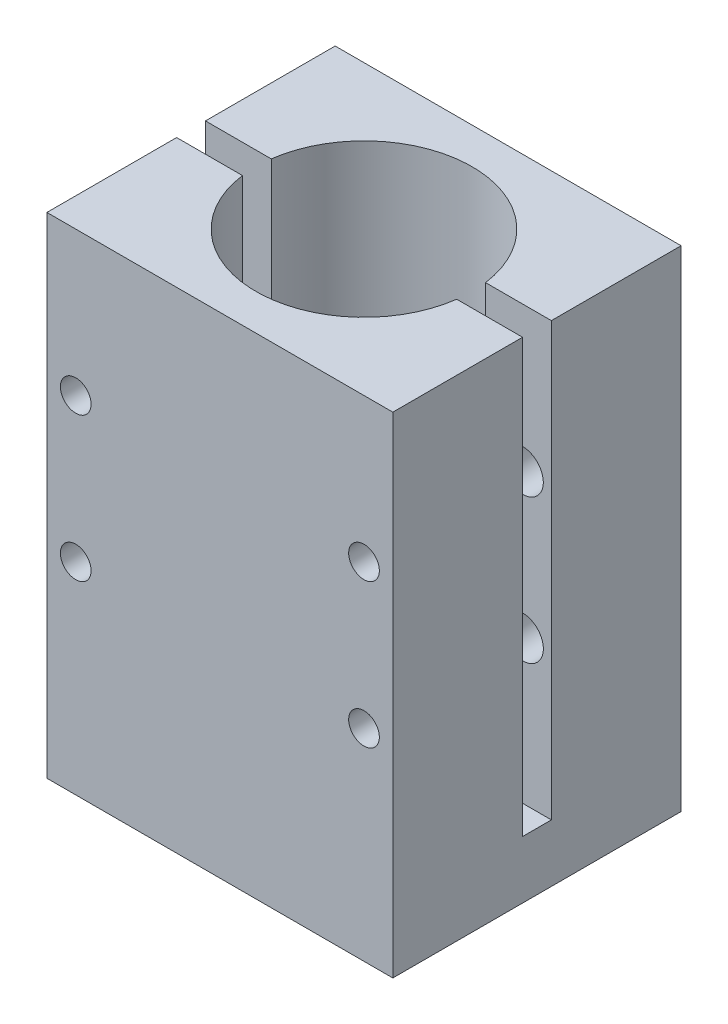
ISO-10303-21;
HEADER;
FILE_DESCRIPTION(('STEP AP214'),'2;1');
FILE_NAME('part.step','',(''),(''),'','','');
FILE_SCHEMA(('AUTOMOTIVE_DESIGN { 1 0 10303 214 1 1 1 1 }'));
ENDSEC;
DATA;
#1=APPLICATION_CONTEXT('core data for automotive mechanical design processes');
#2=APPLICATION_PROTOCOL_DEFINITION('international standard','automotive_design',2000,#1);
#3=PRODUCT_CONTEXT('',#1,'mechanical');
#4=PRODUCT('Part','Part','',(#3));
#5=PRODUCT_RELATED_PRODUCT_CATEGORY('part','',(#4));
#6=PRODUCT_DEFINITION_FORMATION('','',#4);
#7=PRODUCT_DEFINITION_CONTEXT('part definition',#1,'design');
#8=PRODUCT_DEFINITION('design','',#6,#7);
#9=PRODUCT_DEFINITION_SHAPE('','',#8);
#10=(LENGTH_UNIT() NAMED_UNIT(*) SI_UNIT(.MILLI.,.METRE.));
#11=(NAMED_UNIT(*) PLANE_ANGLE_UNIT() SI_UNIT($,.RADIAN.));
#12=(NAMED_UNIT(*) SI_UNIT($,.STERADIAN.) SOLID_ANGLE_UNIT());
#13=UNCERTAINTY_MEASURE_WITH_UNIT(LENGTH_MEASURE(1.E-05),#10,'distance_accuracy_value','');
#14=(GEOMETRIC_REPRESENTATION_CONTEXT(3) GLOBAL_UNCERTAINTY_ASSIGNED_CONTEXT((#13)) GLOBAL_UNIT_ASSIGNED_CONTEXT((#10,
#11,#12)) REPRESENTATION_CONTEXT('',''));
#15=CARTESIAN_POINT('',(0.,0.,0.));
#16=DIRECTION('',(0.,0.,1.));
#17=DIRECTION('',(1.,0.,0.));
#18=AXIS2_PLACEMENT_3D('',#15,#16,#17);
#19=CARTESIAN_POINT('',(-29.21,101.6,0.));
#20=DIRECTION('',(0.,0.,1.));
#21=DIRECTION('',(1.,0.,0.));
#22=AXIS2_PLACEMENT_3D('',#19,#20,#21);
#23=PLANE('',#22);
#24=CARTESIAN_POINT('',(-13.97,55.88,0.));
#25=DIRECTION('',(0.,0.,-1.));
#26=DIRECTION('',(-1.,0.,0.));
#27=AXIS2_PLACEMENT_3D('',#24,#25,#26);
#28=CIRCLE('',#27,1.82879999999999);
#29=CARTESIAN_POINT('',(-15.7988,55.88,0.));
#30=VERTEX_POINT('',#29);
#31=EDGE_CURVE('E326',#30,#30,#28,.T.);
#32=ORIENTED_EDGE('',*,*,#31,.F.);
#33=EDGE_LOOP('',(#32));
#34=FACE_BOUND('',#33,.T.);
#35=CARTESIAN_POINT('',(11.4343213988,55.88,0.));
#36=DIRECTION('',(0.,0.,-1.));
#37=DIRECTION('',(-1.,0.,0.));
#38=AXIS2_PLACEMENT_3D('',#35,#36,#37);
#39=CIRCLE('',#38,1.82879999999999);
#40=CARTESIAN_POINT('',(9.60552139879997,55.88,0.));
#41=VERTEX_POINT('',#40);
#42=EDGE_CURVE('E206',#41,#41,#39,.T.);
#43=ORIENTED_EDGE('',*,*,#42,.F.);
#44=EDGE_LOOP('',(#43));
#45=FACE_BOUND('',#44,.T.);
#46=CARTESIAN_POINT('',(11.43,68.58,0.));
#47=DIRECTION('',(0.,0.,-1.));
#48=DIRECTION('',(-1.,0.,0.));
#49=AXIS2_PLACEMENT_3D('',#46,#47,#48);
#50=CIRCLE('',#49,1.8288);
#51=CARTESIAN_POINT('',(9.60120000000001,68.58,0.));
#52=VERTEX_POINT('',#51);
#53=EDGE_CURVE('E212',#52,#52,#50,.T.);
#54=ORIENTED_EDGE('',*,*,#53,.F.);
#55=EDGE_LOOP('',(#54));
#56=FACE_BOUND('',#55,.T.);
#57=DIRECTION('',(0.,-1.,0.));
#58=VECTOR('',#57,1.);
#59=CARTESIAN_POINT('',(-16.51,101.6,0.));
#60=LINE('',#59,#58);
#61=CARTESIAN_POINT('',(-16.51,81.28,0.));
#62=VERTEX_POINT('',#61);
#63=CARTESIAN_POINT('',(-16.51,38.1,0.));
#64=VERTEX_POINT('',#63);
#65=EDGE_CURVE('E230',#62,#64,#60,.T.);
#66=ORIENTED_EDGE('',*,*,#65,.F.);
#67=DIRECTION('',(-1.,0.,0.));
#68=VECTOR('',#67,1.);
#69=CARTESIAN_POINT('',(13.97,81.28,0.));
#70=LINE('',#69,#68);
#71=CARTESIAN_POINT('',(13.97,81.28,0.));
#72=VERTEX_POINT('',#71);
#73=EDGE_CURVE('E158',#72,#62,#70,.T.);
#74=ORIENTED_EDGE('',*,*,#73,.F.);
#75=DIRECTION('',(0.,1.,0.));
#76=VECTOR('',#75,1.);
#77=CARTESIAN_POINT('',(13.97,101.6,0.));
#78=LINE('',#77,#76);
#79=CARTESIAN_POINT('',(13.97,38.1,0.));
#80=VERTEX_POINT('',#79);
#81=EDGE_CURVE('E244',#80,#72,#78,.T.);
#82=ORIENTED_EDGE('',*,*,#81,.F.);
#83=DIRECTION('',(-1.,0.,0.));
#84=VECTOR('',#83,1.);
#85=CARTESIAN_POINT('',(13.97,38.1,0.));
#86=LINE('',#85,#84);
#87=EDGE_CURVE('E190',#80,#64,#86,.T.);
#88=ORIENTED_EDGE('',*,*,#87,.T.);
#89=EDGE_LOOP('',(#66,#74,#82,#88));
#90=FACE_BOUND('',#89,.T.);
#91=CARTESIAN_POINT('',(-13.97,68.58,0.));
#92=DIRECTION('',(0.,0.,-1.));
#93=DIRECTION('',(-1.,0.,0.));
#94=AXIS2_PLACEMENT_3D('',#91,#92,#93);
#95=CIRCLE('',#94,1.82879999999999);
#96=CARTESIAN_POINT('',(-15.7988,68.58,0.));
#97=VERTEX_POINT('',#96);
#98=EDGE_CURVE('E477',#97,#97,#95,.T.);
#99=ORIENTED_EDGE('',*,*,#98,.F.);
#100=EDGE_LOOP('',(#99));
#101=FACE_BOUND('',#100,.T.);
#102=ADVANCED_FACE('F36',(#34,#45,#56,#90,#101),#23,.F.);
#103=CARTESIAN_POINT('',(-29.21,101.6,25.4));
#104=DIRECTION('',(0.,0.,-1.));
#105=DIRECTION('',(-1.,0.,0.));
#106=AXIS2_PLACEMENT_3D('',#103,#104,#105);
#107=PLANE('',#106);
#108=DIRECTION('',(0.,-1.,0.));
#109=VECTOR('',#108,1.);
#110=CARTESIAN_POINT('',(13.97,101.6,25.4));
#111=LINE('',#110,#109);
#112=CARTESIAN_POINT('',(13.97,81.28,25.4));
#113=VERTEX_POINT('',#112);
#114=CARTESIAN_POINT('',(13.97,38.1,25.4));
#115=VERTEX_POINT('',#114);
#116=EDGE_CURVE('E242',#113,#115,#111,.T.);
#117=ORIENTED_EDGE('',*,*,#116,.F.);
#118=DIRECTION('',(-1.,0.,0.));
#119=VECTOR('',#118,1.);
#120=CARTESIAN_POINT('',(13.97,81.28,25.4));
#121=LINE('',#120,#119);
#122=CARTESIAN_POINT('',(-16.51,81.28,25.4));
#123=VERTEX_POINT('',#122);
#124=EDGE_CURVE('E154',#113,#123,#121,.T.);
#125=ORIENTED_EDGE('',*,*,#124,.T.);
#126=DIRECTION('',(0.,1.,0.));
#127=VECTOR('',#126,1.);
#128=CARTESIAN_POINT('',(-16.51,101.6,25.4));
#129=LINE('',#128,#127);
#130=CARTESIAN_POINT('',(-16.51,38.1,25.4));
#131=VERTEX_POINT('',#130);
#132=EDGE_CURVE('E240',#131,#123,#129,.T.);
#133=ORIENTED_EDGE('',*,*,#132,.F.);
#134=DIRECTION('',(-1.,0.,0.));
#135=VECTOR('',#134,1.);
#136=CARTESIAN_POINT('',(13.97,38.1,25.4));
#137=LINE('',#136,#135);
#138=EDGE_CURVE('E189',#115,#131,#137,.T.);
#139=ORIENTED_EDGE('',*,*,#138,.F.);
#140=EDGE_LOOP('',(#117,#125,#133,#139));
#141=FACE_BOUND('',#140,.T.);
#142=CARTESIAN_POINT('',(11.43,68.58,25.4));
#143=DIRECTION('',(0.,0.,1.));
#144=DIRECTION('',(1.,0.,0.));
#145=AXIS2_PLACEMENT_3D('',#142,#143,#144);
#146=CIRCLE('',#145,1.35255);
#147=CARTESIAN_POINT('',(12.78255,68.58,25.4));
#148=VERTEX_POINT('',#147);
#149=EDGE_CURVE('E200',#148,#148,#146,.T.);
#150=ORIENTED_EDGE('',*,*,#149,.F.);
#151=EDGE_LOOP('',(#150));
#152=FACE_BOUND('',#151,.T.);
#153=CARTESIAN_POINT('',(11.43,55.88,25.4));
#154=DIRECTION('',(0.,0.,1.));
#155=DIRECTION('',(1.,0.,0.));
#156=AXIS2_PLACEMENT_3D('',#153,#154,#155);
#157=CIRCLE('',#156,1.35254999999999);
#158=CARTESIAN_POINT('',(12.78255,55.88,25.4));
#159=VERTEX_POINT('',#158);
#160=EDGE_CURVE('E193',#159,#159,#157,.T.);
#161=ORIENTED_EDGE('',*,*,#160,.F.);
#162=EDGE_LOOP('',(#161));
#163=FACE_BOUND('',#162,.T.);
#164=CARTESIAN_POINT('',(-13.97,68.58,25.4));
#165=DIRECTION('',(0.,0.,1.));
#166=DIRECTION('',(1.,0.,0.));
#167=AXIS2_PLACEMENT_3D('',#164,#165,#166);
#168=CIRCLE('',#167,1.35254999999999);
#169=CARTESIAN_POINT('',(-12.61745,68.58,25.4));
#170=VERTEX_POINT('',#169);
#171=EDGE_CURVE('E254',#170,#170,#168,.T.);
#172=ORIENTED_EDGE('',*,*,#171,.F.);
#173=EDGE_LOOP('',(#172));
#174=FACE_BOUND('',#173,.T.);
#175=CARTESIAN_POINT('',(-13.97,55.88,25.4));
#176=DIRECTION('',(0.,0.,1.));
#177=DIRECTION('',(1.,0.,0.));
#178=AXIS2_PLACEMENT_3D('',#175,#176,#177);
#179=CIRCLE('',#178,1.35254999999999);
#180=CARTESIAN_POINT('',(-12.61745,55.88,25.4));
#181=VERTEX_POINT('',#180);
#182=EDGE_CURVE('E261',#181,#181,#179,.T.);
#183=ORIENTED_EDGE('',*,*,#182,.F.);
#184=EDGE_LOOP('',(#183));
#185=FACE_BOUND('',#184,.T.);
#186=ADVANCED_FACE('F38',(#141,#152,#163,#174,#185),#107,.F.);
#187=CARTESIAN_POINT('',(-1.26999999999999,43.18,12.7));
#188=DIRECTION('',(0.,1.,0.));
#189=DIRECTION('',(0.,0.,1.));
#190=AXIS2_PLACEMENT_3D('',#187,#188,#189);
#191=CYLINDRICAL_SURFACE('',#190,9.525);
#192=CARTESIAN_POINT('',(-1.26999999999999,81.28,12.7));
#193=DIRECTION('',(0.,-1.,0.));
#194=DIRECTION('',(0.,0.,-1.));
#195=AXIS2_PLACEMENT_3D('',#192,#193,#194);
#196=CIRCLE('',#195,9.525);
#197=CARTESIAN_POINT('',(8.16995365454726,81.28,11.43));
#198=VERTEX_POINT('',#197);
#199=CARTESIAN_POINT('',(-10.7099536545472,81.28,11.4299999999999));
#200=VERTEX_POINT('',#199);
#201=EDGE_CURVE('E165',#198,#200,#196,.F.);
#202=ORIENTED_EDGE('',*,*,#201,.T.);
#203=DIRECTION('',(0.,1.,0.));
#204=VECTOR('',#203,1.);
#205=CARTESIAN_POINT('',(-10.7099536545472,43.18,11.4299999999999));
#206=LINE('',#205,#204);
#207=CARTESIAN_POINT('',(-10.7099536545472,43.18,11.4299999999999));
#208=VERTEX_POINT('',#207);
#209=EDGE_CURVE('E149',#208,#200,#206,.T.);
#210=ORIENTED_EDGE('',*,*,#209,.F.);
#211=CARTESIAN_POINT('',(-1.26999999999999,43.18,12.7));
#212=DIRECTION('',(0.,1.,0.));
#213=DIRECTION('',(0.,0.,1.));
#214=AXIS2_PLACEMENT_3D('',#211,#212,#213);
#215=CIRCLE('',#214,9.525);
#216=CARTESIAN_POINT('',(8.16995365454726,43.18,11.43));
#217=VERTEX_POINT('',#216);
#218=EDGE_CURVE('E248',#217,#208,#215,.T.);
#219=ORIENTED_EDGE('',*,*,#218,.F.);
#220=DIRECTION('',(0.,1.,0.));
#221=VECTOR('',#220,1.);
#222=CARTESIAN_POINT('',(8.16995365454726,43.18,11.43));
#223=LINE('',#222,#221);
#224=EDGE_CURVE('E234',#217,#198,#223,.T.);
#225=ORIENTED_EDGE('',*,*,#224,.T.);
#226=EDGE_LOOP('',(#202,#210,#219,#225));
#227=FACE_BOUND('',#226,.T.);
#228=ADVANCED_FACE('F272',(#227),#191,.F.);
#229=CARTESIAN_POINT('',(13.97,81.28,25.4));
#230=DIRECTION('',(0.,-1.,0.));
#231=DIRECTION('',(0.,0.,-1.));
#232=AXIS2_PLACEMENT_3D('',#229,#230,#231);
#233=PLANE('',#232);
#234=DIRECTION('',(0.,0.,-1.));
#235=VECTOR('',#234,1.);
#236=CARTESIAN_POINT('',(-16.51,81.28,25.4));
#237=LINE('',#236,#235);
#238=CARTESIAN_POINT('',(-16.51,81.28,11.4299999999999));
#239=VERTEX_POINT('',#238);
#240=EDGE_CURVE('E61',#239,#62,#237,.T.);
#241=ORIENTED_EDGE('',*,*,#240,.F.);
#242=DIRECTION('',(1.,0.,0.));
#243=VECTOR('',#242,1.);
#244=CARTESIAN_POINT('',(13.9700000000001,81.28,11.4300000000001));
#245=LINE('',#244,#243);
#246=EDGE_CURVE('E11',#239,#200,#245,.T.);
#247=ORIENTED_EDGE('',*,*,#246,.T.);
#248=ORIENTED_EDGE('',*,*,#201,.F.);
#249=DIRECTION('',(-1.,0.,0.));
#250=VECTOR('',#249,1.);
#251=CARTESIAN_POINT('',(13.97,81.28,11.43));
#252=LINE('',#251,#250);
#253=CARTESIAN_POINT('',(13.97,81.28,11.43));
#254=VERTEX_POINT('',#253);
#255=EDGE_CURVE('E168',#254,#198,#252,.T.);
#256=ORIENTED_EDGE('',*,*,#255,.F.);
#257=DIRECTION('',(0.,0.,-1.));
#258=VECTOR('',#257,1.);
#259=CARTESIAN_POINT('',(13.97,81.28,25.4));
#260=LINE('',#259,#258);
#261=EDGE_CURVE('E157',#254,#72,#260,.T.);
#262=ORIENTED_EDGE('',*,*,#261,.T.);
#263=ORIENTED_EDGE('',*,*,#73,.T.);
#264=EDGE_LOOP('',(#241,#247,#248,#256,#262,#263));
#265=FACE_BOUND('',#264,.T.);
#266=ADVANCED_FACE('F271',(#265),#233,.F.);
#267=CARTESIAN_POINT('',(13.97,43.18,13.97));
#268=DIRECTION('',(0.,0.,1.));
#269=DIRECTION('',(1.,0.,0.));
#270=AXIS2_PLACEMENT_3D('',#267,#268,#269);
#271=PLANE('',#270);
#272=CARTESIAN_POINT('',(11.43,68.58,13.97));
#273=DIRECTION('',(0.,0.,1.));
#274=DIRECTION('',(1.,0.,0.));
#275=AXIS2_PLACEMENT_3D('',#272,#273,#274);
#276=CIRCLE('',#275,1.35255);
#277=CARTESIAN_POINT('',(12.78255,68.58,13.97));
#278=VERTEX_POINT('',#277);
#279=EDGE_CURVE('E203',#278,#278,#276,.F.);
#280=ORIENTED_EDGE('',*,*,#279,.F.);
#281=EDGE_LOOP('',(#280));
#282=FACE_BOUND('',#281,.T.);
#283=DIRECTION('',(0.,1.,0.));
#284=VECTOR('',#283,1.);
#285=CARTESIAN_POINT('',(8.16995365454726,43.18,13.97));
#286=LINE('',#285,#284);
#287=CARTESIAN_POINT('',(8.16995365454726,43.18,13.97));
#288=VERTEX_POINT('',#287);
#289=CARTESIAN_POINT('',(8.16995365454726,81.28,13.97));
#290=VERTEX_POINT('',#289);
#291=EDGE_CURVE('E231',#288,#290,#286,.T.);
#292=ORIENTED_EDGE('',*,*,#291,.T.);
#293=DIRECTION('',(1.,0.,0.));
#294=VECTOR('',#293,1.);
#295=CARTESIAN_POINT('',(13.97,81.28,13.97));
#296=LINE('',#295,#294);
#297=CARTESIAN_POINT('',(13.97,81.28,13.97));
#298=VERTEX_POINT('',#297);
#299=EDGE_CURVE('E171',#290,#298,#296,.T.);
#300=ORIENTED_EDGE('',*,*,#299,.T.);
#301=DIRECTION('',(0.,1.,0.));
#302=VECTOR('',#301,1.);
#303=CARTESIAN_POINT('',(13.97,43.18,13.97));
#304=LINE('',#303,#302);
#305=CARTESIAN_POINT('',(13.97,43.18,13.97));
#306=VERTEX_POINT('',#305);
#307=EDGE_CURVE('E227',#306,#298,#304,.T.);
#308=ORIENTED_EDGE('',*,*,#307,.F.);
#309=DIRECTION('',(1.,0.,0.));
#310=VECTOR('',#309,1.);
#311=CARTESIAN_POINT('',(13.97,43.18,13.97));
#312=LINE('',#311,#310);
#313=EDGE_CURVE('E224',#288,#306,#312,.T.);
#314=ORIENTED_EDGE('',*,*,#313,.F.);
#315=EDGE_LOOP('',(#292,#300,#308,#314));
#316=FACE_BOUND('',#315,.T.);
#317=CARTESIAN_POINT('',(11.43,55.88,13.97));
#318=DIRECTION('',(0.,0.,1.));
#319=DIRECTION('',(1.,0.,0.));
#320=AXIS2_PLACEMENT_3D('',#317,#318,#319);
#321=CIRCLE('',#320,1.35254999999999);
#322=CARTESIAN_POINT('',(12.78255,55.88,13.97));
#323=VERTEX_POINT('',#322);
#324=EDGE_CURVE('E197',#323,#323,#321,.F.);
#325=ORIENTED_EDGE('',*,*,#324,.F.);
#326=EDGE_LOOP('',(#325));
#327=FACE_BOUND('',#326,.T.);
#328=ADVANCED_FACE('F303',(#282,#316,#327),#271,.F.);
#329=CARTESIAN_POINT('',(13.97,43.18,11.43));
#330=DIRECTION('',(0.,0.,-1.));
#331=DIRECTION('',(-1.,0.,0.));
#332=AXIS2_PLACEMENT_3D('',#329,#330,#331);
#333=PLANE('',#332);
#334=CARTESIAN_POINT('',(11.43,68.58,11.43));
#335=DIRECTION('',(0.,0.,-1.));
#336=DIRECTION('',(-1.,0.,0.));
#337=AXIS2_PLACEMENT_3D('',#334,#335,#336);
#338=CIRCLE('',#337,1.8288);
#339=CARTESIAN_POINT('',(9.60120000000001,68.58,11.43));
#340=VERTEX_POINT('',#339);
#341=EDGE_CURVE('E215',#340,#340,#338,.F.);
#342=ORIENTED_EDGE('',*,*,#341,.F.);
#343=EDGE_LOOP('',(#342));
#344=FACE_BOUND('',#343,.T.);
#345=DIRECTION('',(0.,1.,0.));
#346=VECTOR('',#345,1.);
#347=CARTESIAN_POINT('',(13.97,43.18,11.43));
#348=LINE('',#347,#346);
#349=CARTESIAN_POINT('',(13.97,43.18,11.43));
#350=VERTEX_POINT('',#349);
#351=EDGE_CURVE('E226',#350,#254,#348,.T.);
#352=ORIENTED_EDGE('',*,*,#351,.T.);
#353=ORIENTED_EDGE('',*,*,#255,.T.);
#354=ORIENTED_EDGE('',*,*,#224,.F.);
#355=DIRECTION('',(-1.,0.,0.));
#356=VECTOR('',#355,1.);
#357=CARTESIAN_POINT('',(13.97,43.18,11.43));
#358=LINE('',#357,#356);
#359=EDGE_CURVE('E221',#350,#217,#358,.T.);
#360=ORIENTED_EDGE('',*,*,#359,.F.);
#361=EDGE_LOOP('',(#352,#353,#354,#360));
#362=FACE_BOUND('',#361,.T.);
#363=CARTESIAN_POINT('',(11.4343213988,55.88,11.43));
#364=DIRECTION('',(0.,0.,-1.));
#365=DIRECTION('',(-1.,0.,0.));
#366=AXIS2_PLACEMENT_3D('',#363,#364,#365);
#367=CIRCLE('',#366,1.82879999999999);
#368=CARTESIAN_POINT('',(9.60552139879997,55.88,11.43));
#369=VERTEX_POINT('',#368);
#370=EDGE_CURVE('E209',#369,#369,#367,.F.);
#371=ORIENTED_EDGE('',*,*,#370,.F.);
#372=EDGE_LOOP('',(#371));
#373=FACE_BOUND('',#372,.T.);
#374=ADVANCED_FACE('F274',(#344,#362,#373),#333,.F.);
#375=CARTESIAN_POINT('',(-10.7099536545473,43.18,13.9699999999999));
#376=VERTEX_POINT('',#375);
#377=EDGE_CURVE('E247',#376,#288,#215,.T.);
#378=ORIENTED_EDGE('',*,*,#377,.F.);
#379=DIRECTION('',(0.,1.,0.));
#380=VECTOR('',#379,1.);
#381=CARTESIAN_POINT('',(-10.7099536545473,43.18,13.9699999999999));
#382=LINE('',#381,#380);
#383=CARTESIAN_POINT('',(-10.7099536545473,81.28,13.9699999999999));
#384=VERTEX_POINT('',#383);
#385=EDGE_CURVE('E131',#376,#384,#382,.T.);
#386=ORIENTED_EDGE('',*,*,#385,.T.);
#387=EDGE_CURVE('E162',#384,#290,#196,.F.);
#388=ORIENTED_EDGE('',*,*,#387,.T.);
#389=ORIENTED_EDGE('',*,*,#291,.F.);
#390=EDGE_LOOP('',(#378,#386,#388,#389));
#391=FACE_BOUND('',#390,.T.);
#392=ADVANCED_FACE('F307',(#391),#191,.F.);
#393=CARTESIAN_POINT('',(-1.26999999999999,43.18,12.7));
#394=DIRECTION('',(0.,1.,0.));
#395=DIRECTION('',(0.,0.,1.));
#396=AXIS2_PLACEMENT_3D('',#393,#394,#395);
#397=PLANE('',#396);
#398=ORIENTED_EDGE('',*,*,#218,.T.);
#399=DIRECTION('',(-1.,0.,0.));
#400=VECTOR('',#399,1.);
#401=CARTESIAN_POINT('',(-16.51,43.18,11.4299999999999));
#402=LINE('',#401,#400);
#403=CARTESIAN_POINT('',(-16.51,43.18,11.4299999999999));
#404=VERTEX_POINT('',#403);
#405=EDGE_CURVE('E134',#208,#404,#402,.T.);
#406=ORIENTED_EDGE('',*,*,#405,.T.);
#407=DIRECTION('',(0.,0.,1.));
#408=VECTOR('',#407,1.);
#409=CARTESIAN_POINT('',(-16.51,43.18,11.4299999999999));
#410=LINE('',#409,#408);
#411=CARTESIAN_POINT('',(-16.51,43.18,13.9699999999999));
#412=VERTEX_POINT('',#411);
#413=EDGE_CURVE('E135',#404,#412,#410,.T.);
#414=ORIENTED_EDGE('',*,*,#413,.T.);
#415=DIRECTION('',(1.,0.,0.));
#416=VECTOR('',#415,1.);
#417=CARTESIAN_POINT('',(-16.51,43.18,13.9699999999999));
#418=LINE('',#417,#416);
#419=EDGE_CURVE('E126',#412,#376,#418,.T.);
#420=ORIENTED_EDGE('',*,*,#419,.T.);
#421=ORIENTED_EDGE('',*,*,#377,.T.);
#422=ORIENTED_EDGE('',*,*,#313,.T.);
#423=DIRECTION('',(0.,0.,-1.));
#424=VECTOR('',#423,1.);
#425=CARTESIAN_POINT('',(13.97,43.18,13.97));
#426=LINE('',#425,#424);
#427=EDGE_CURVE('E218',#306,#350,#426,.T.);
#428=ORIENTED_EDGE('',*,*,#427,.T.);
#429=ORIENTED_EDGE('',*,*,#359,.T.);
#430=EDGE_LOOP('',(#398,#406,#414,#420,#421,#422,#428,#429));
#431=FACE_BOUND('',#430,.T.);
#432=CARTESIAN_POINT('',(-1.26999999999995,43.18,6.35));
#433=DIRECTION('',(0.,1.,0.));
#434=DIRECTION('',(0.,0.,1.));
#435=AXIS2_PLACEMENT_3D('',#432,#433,#434);
#436=CIRCLE('',#435,1.72719999999999);
#437=CARTESIAN_POINT('',(-1.26999999999995,43.18,8.07719999999999));
#438=VERTEX_POINT('',#437);
#439=EDGE_CURVE('E177',#438,#438,#436,.T.);
#440=ORIENTED_EDGE('',*,*,#439,.F.);
#441=EDGE_LOOP('',(#440));
#442=FACE_BOUND('',#441,.T.);
#443=CARTESIAN_POINT('',(-1.26999999999999,43.18,19.05));
#444=DIRECTION('',(0.,1.,0.));
#445=DIRECTION('',(0.,0.,1.));
#446=AXIS2_PLACEMENT_3D('',#443,#444,#445);
#447=CIRCLE('',#446,1.72719999999999);
#448=CARTESIAN_POINT('',(-1.26999999999999,43.18,20.7772));
#449=VERTEX_POINT('',#448);
#450=EDGE_CURVE('E183',#449,#449,#447,.T.);
#451=ORIENTED_EDGE('',*,*,#450,.F.);
#452=EDGE_LOOP('',(#451));
#453=FACE_BOUND('',#452,.T.);
#454=ADVANCED_FACE('F140',(#431,#442,#453),#397,.T.);
#455=CARTESIAN_POINT('',(13.97,0.,25.4));
#456=DIRECTION('',(1.,0.,0.));
#457=DIRECTION('',(0.,0.,-1.));
#458=AXIS2_PLACEMENT_3D('',#455,#456,#457);
#459=PLANE('',#458);
#460=EDGE_CURVE('E163',#113,#298,#260,.T.);
#461=ORIENTED_EDGE('',*,*,#460,.F.);
#462=ORIENTED_EDGE('',*,*,#116,.T.);
#463=DIRECTION('',(0.,0.,-1.));
#464=VECTOR('',#463,1.);
#465=CARTESIAN_POINT('',(13.97,38.1,0.));
#466=LINE('',#465,#464);
#467=EDGE_CURVE('E186',#115,#80,#466,.T.);
#468=ORIENTED_EDGE('',*,*,#467,.T.);
#469=ORIENTED_EDGE('',*,*,#81,.T.);
#470=ORIENTED_EDGE('',*,*,#261,.F.);
#471=ORIENTED_EDGE('',*,*,#351,.F.);
#472=ORIENTED_EDGE('',*,*,#427,.F.);
#473=ORIENTED_EDGE('',*,*,#307,.T.);
#474=EDGE_LOOP('',(#461,#462,#468,#469,#470,#471,#472,#473));
#475=FACE_BOUND('',#474,.T.);
#476=ADVANCED_FACE('F283',(#475),#459,.T.);
#477=CARTESIAN_POINT('',(-16.51,0.,0.));
#478=DIRECTION('',(-1.,0.,0.));
#479=DIRECTION('',(0.,0.,1.));
#480=AXIS2_PLACEMENT_3D('',#477,#478,#479);
#481=PLANE('',#480);
#482=DIRECTION('',(0.,1.,0.));
#483=VECTOR('',#482,1.);
#484=CARTESIAN_POINT('',(-16.51,43.18,11.4299999999999));
#485=LINE('',#484,#483);
#486=EDGE_CURVE('E160',#404,#239,#485,.T.);
#487=ORIENTED_EDGE('',*,*,#486,.T.);
#488=ORIENTED_EDGE('',*,*,#240,.T.);
#489=ORIENTED_EDGE('',*,*,#65,.T.);
#490=DIRECTION('',(0.,0.,-1.));
#491=VECTOR('',#490,1.);
#492=CARTESIAN_POINT('',(-16.51,38.1,0.));
#493=LINE('',#492,#491);
#494=EDGE_CURVE('E250',#131,#64,#493,.T.);
#495=ORIENTED_EDGE('',*,*,#494,.F.);
#496=ORIENTED_EDGE('',*,*,#132,.T.);
#497=CARTESIAN_POINT('',(-16.51,81.28,13.9699999999999));
#498=VERTEX_POINT('',#497);
#499=EDGE_CURVE('E147',#123,#498,#237,.T.);
#500=ORIENTED_EDGE('',*,*,#499,.T.);
#501=DIRECTION('',(0.,1.,0.));
#502=VECTOR('',#501,1.);
#503=CARTESIAN_POINT('',(-16.51,43.18,13.9699999999999));
#504=LINE('',#503,#502);
#505=EDGE_CURVE('E53',#412,#498,#504,.T.);
#506=ORIENTED_EDGE('',*,*,#505,.F.);
#507=ORIENTED_EDGE('',*,*,#413,.F.);
#508=EDGE_LOOP('',(#487,#488,#489,#495,#496,#500,#506,#507));
#509=FACE_BOUND('',#508,.T.);
#510=ADVANCED_FACE('F145',(#509),#481,.T.);
#511=CARTESIAN_POINT('',(11.43,68.58,0.));
#512=DIRECTION('',(0.,0.,-1.));
#513=DIRECTION('',(-1.,0.,0.));
#514=AXIS2_PLACEMENT_3D('',#511,#512,#513);
#515=CYLINDRICAL_SURFACE('',#514,1.8288);
#516=ORIENTED_EDGE('',*,*,#341,.T.);
#517=EDGE_LOOP('',(#516));
#518=FACE_BOUND('',#517,.T.);
#519=ORIENTED_EDGE('',*,*,#53,.T.);
#520=EDGE_LOOP('',(#519));
#521=FACE_BOUND('',#520,.T.);
#522=ADVANCED_FACE('F331',(#518,#521),#515,.F.);
#523=CARTESIAN_POINT('',(11.4343213988,55.88,0.));
#524=DIRECTION('',(0.,0.,-1.));
#525=DIRECTION('',(-1.,0.,0.));
#526=AXIS2_PLACEMENT_3D('',#523,#524,#525);
#527=CYLINDRICAL_SURFACE('',#526,1.82879999999999);
#528=ORIENTED_EDGE('',*,*,#370,.T.);
#529=EDGE_LOOP('',(#528));
#530=FACE_BOUND('',#529,.T.);
#531=ORIENTED_EDGE('',*,*,#42,.T.);
#532=EDGE_LOOP('',(#531));
#533=FACE_BOUND('',#532,.T.);
#534=ADVANCED_FACE('F333',(#530,#533),#527,.F.);
#535=CARTESIAN_POINT('',(11.43,68.58,25.4));
#536=DIRECTION('',(0.,0.,1.));
#537=DIRECTION('',(1.,0.,0.));
#538=AXIS2_PLACEMENT_3D('',#535,#536,#537);
#539=CYLINDRICAL_SURFACE('',#538,1.35255);
#540=ORIENTED_EDGE('',*,*,#279,.T.);
#541=EDGE_LOOP('',(#540));
#542=FACE_BOUND('',#541,.T.);
#543=ORIENTED_EDGE('',*,*,#149,.T.);
#544=EDGE_LOOP('',(#543));
#545=FACE_BOUND('',#544,.T.);
#546=ADVANCED_FACE('F340',(#542,#545),#539,.F.);
#547=CARTESIAN_POINT('',(11.43,55.88,25.4));
#548=DIRECTION('',(0.,0.,1.));
#549=DIRECTION('',(1.,0.,0.));
#550=AXIS2_PLACEMENT_3D('',#547,#548,#549);
#551=CYLINDRICAL_SURFACE('',#550,1.35254999999999);
#552=ORIENTED_EDGE('',*,*,#324,.T.);
#553=EDGE_LOOP('',(#552));
#554=FACE_BOUND('',#553,.T.);
#555=ORIENTED_EDGE('',*,*,#160,.T.);
#556=EDGE_LOOP('',(#555));
#557=FACE_BOUND('',#556,.T.);
#558=ADVANCED_FACE('F458',(#554,#557),#551,.F.);
#559=CARTESIAN_POINT('',(13.97,38.1,0.));
#560=DIRECTION('',(0.,1.,0.));
#561=DIRECTION('',(0.,0.,1.));
#562=AXIS2_PLACEMENT_3D('',#559,#560,#561);
#563=PLANE('',#562);
#564=CARTESIAN_POINT('',(-1.26999999999995,38.1,6.35));
#565=DIRECTION('',(0.,-1.,0.));
#566=DIRECTION('',(0.,0.,-1.));
#567=AXIS2_PLACEMENT_3D('',#564,#565,#566);
#568=CIRCLE('',#567,1.72719999999999);
#569=CARTESIAN_POINT('',(-1.26999999999995,38.1,4.62280000000002));
#570=VERTEX_POINT('',#569);
#571=EDGE_CURVE('E174',#570,#570,#568,.T.);
#572=ORIENTED_EDGE('',*,*,#571,.F.);
#573=EDGE_LOOP('',(#572));
#574=FACE_BOUND('',#573,.T.);
#575=CARTESIAN_POINT('',(-1.26999999999999,38.1,19.05));
#576=DIRECTION('',(0.,-1.,0.));
#577=DIRECTION('',(0.,0.,-1.));
#578=AXIS2_PLACEMENT_3D('',#575,#576,#577);
#579=CIRCLE('',#578,1.72719999999999);
#580=CARTESIAN_POINT('',(-1.26999999999999,38.1,17.3228));
#581=VERTEX_POINT('',#580);
#582=EDGE_CURVE('E180',#581,#581,#579,.T.);
#583=ORIENTED_EDGE('',*,*,#582,.F.);
#584=EDGE_LOOP('',(#583));
#585=FACE_BOUND('',#584,.T.);
#586=ORIENTED_EDGE('',*,*,#494,.T.);
#587=ORIENTED_EDGE('',*,*,#87,.F.);
#588=ORIENTED_EDGE('',*,*,#467,.F.);
#589=ORIENTED_EDGE('',*,*,#138,.T.);
#590=EDGE_LOOP('',(#586,#587,#588,#589));
#591=FACE_BOUND('',#590,.T.);
#592=ADVANCED_FACE('F292',(#574,#585,#591),#563,.F.);
#593=CARTESIAN_POINT('',(-1.26999999999999,38.1,19.05));
#594=DIRECTION('',(0.,-1.,0.));
#595=DIRECTION('',(0.,0.,-1.));
#596=AXIS2_PLACEMENT_3D('',#593,#594,#595);
#597=CYLINDRICAL_SURFACE('',#596,1.72719999999999);
#598=ORIENTED_EDGE('',*,*,#450,.T.);
#599=EDGE_LOOP('',(#598));
#600=FACE_BOUND('',#599,.T.);
#601=ORIENTED_EDGE('',*,*,#582,.T.);
#602=EDGE_LOOP('',(#601));
#603=FACE_BOUND('',#602,.T.);
#604=ADVANCED_FACE('F451',(#600,#603),#597,.F.);
#605=CARTESIAN_POINT('',(-1.26999999999995,38.1,6.35));
#606=DIRECTION('',(0.,-1.,0.));
#607=DIRECTION('',(0.,0.,-1.));
#608=AXIS2_PLACEMENT_3D('',#605,#606,#607);
#609=CYLINDRICAL_SURFACE('',#608,1.72719999999999);
#610=ORIENTED_EDGE('',*,*,#439,.T.);
#611=EDGE_LOOP('',(#610));
#612=FACE_BOUND('',#611,.T.);
#613=ORIENTED_EDGE('',*,*,#571,.T.);
#614=EDGE_LOOP('',(#613));
#615=FACE_BOUND('',#614,.T.);
#616=ADVANCED_FACE('F372',(#612,#615),#609,.F.);
#617=ORIENTED_EDGE('',*,*,#387,.F.);
#618=DIRECTION('',(-1.,0.,0.));
#619=VECTOR('',#618,1.);
#620=CARTESIAN_POINT('',(13.9700000000001,81.28,13.9700000000001));
#621=LINE('',#620,#619);
#622=EDGE_CURVE('E45',#384,#498,#621,.T.);
#623=ORIENTED_EDGE('',*,*,#622,.T.);
#624=ORIENTED_EDGE('',*,*,#499,.F.);
#625=ORIENTED_EDGE('',*,*,#124,.F.);
#626=ORIENTED_EDGE('',*,*,#460,.T.);
#627=ORIENTED_EDGE('',*,*,#299,.F.);
#628=EDGE_LOOP('',(#617,#623,#624,#625,#626,#627));
#629=FACE_BOUND('',#628,.T.);
#630=ADVANCED_FACE('F300',(#629),#233,.F.);
#631=CARTESIAN_POINT('',(-16.51,43.18,11.4299999999999));
#632=DIRECTION('',(0.,0.,-1.));
#633=DIRECTION('',(-1.,0.,0.));
#634=AXIS2_PLACEMENT_3D('',#631,#632,#633);
#635=PLANE('',#634);
#636=CARTESIAN_POINT('',(-13.97,55.88,11.4299999999999));
#637=DIRECTION('',(0.,0.,-1.));
#638=DIRECTION('',(-1.,0.,0.));
#639=AXIS2_PLACEMENT_3D('',#636,#637,#638);
#640=CIRCLE('',#639,1.82879999999999);
#641=CARTESIAN_POINT('',(-15.7988,55.88,11.4299999999999));
#642=VERTEX_POINT('',#641);
#643=EDGE_CURVE('E481',#642,#642,#640,.T.);
#644=ORIENTED_EDGE('',*,*,#643,.T.);
#645=EDGE_LOOP('',(#644));
#646=FACE_BOUND('',#645,.T.);
#647=CARTESIAN_POINT('',(-13.97,68.58,11.4299999999999));
#648=DIRECTION('',(0.,0.,-1.));
#649=DIRECTION('',(-1.,0.,0.));
#650=AXIS2_PLACEMENT_3D('',#647,#648,#649);
#651=CIRCLE('',#650,1.82879999999999);
#652=CARTESIAN_POINT('',(-15.7988,68.58,11.4299999999999));
#653=VERTEX_POINT('',#652);
#654=EDGE_CURVE('E475',#653,#653,#651,.T.);
#655=ORIENTED_EDGE('',*,*,#654,.T.);
#656=EDGE_LOOP('',(#655));
#657=FACE_BOUND('',#656,.T.);
#658=ORIENTED_EDGE('',*,*,#486,.F.);
#659=ORIENTED_EDGE('',*,*,#405,.F.);
#660=ORIENTED_EDGE('',*,*,#209,.T.);
#661=ORIENTED_EDGE('',*,*,#246,.F.);
#662=EDGE_LOOP('',(#658,#659,#660,#661));
#663=FACE_BOUND('',#662,.T.);
#664=ADVANCED_FACE('F267',(#646,#657,#663),#635,.F.);
#665=CARTESIAN_POINT('',(-16.51,43.18,13.9699999999999));
#666=DIRECTION('',(0.,0.,1.));
#667=DIRECTION('',(1.,0.,0.));
#668=AXIS2_PLACEMENT_3D('',#665,#666,#667);
#669=PLANE('',#668);
#670=ORIENTED_EDGE('',*,*,#385,.F.);
#671=ORIENTED_EDGE('',*,*,#419,.F.);
#672=ORIENTED_EDGE('',*,*,#505,.T.);
#673=ORIENTED_EDGE('',*,*,#622,.F.);
#674=EDGE_LOOP('',(#670,#671,#672,#673));
#675=FACE_BOUND('',#674,.T.);
#676=CARTESIAN_POINT('',(-13.97,68.58,13.9699999999999));
#677=DIRECTION('',(0.,0.,1.));
#678=DIRECTION('',(1.,0.,0.));
#679=AXIS2_PLACEMENT_3D('',#676,#677,#678);
#680=CIRCLE('',#679,1.35254999999999);
#681=CARTESIAN_POINT('',(-12.61745,68.58,13.9699999999999));
#682=VERTEX_POINT('',#681);
#683=EDGE_CURVE('E142',#682,#682,#680,.T.);
#684=ORIENTED_EDGE('',*,*,#683,.T.);
#685=EDGE_LOOP('',(#684));
#686=FACE_BOUND('',#685,.T.);
#687=CARTESIAN_POINT('',(-13.97,55.88,13.9699999999999));
#688=DIRECTION('',(0.,0.,1.));
#689=DIRECTION('',(1.,0.,0.));
#690=AXIS2_PLACEMENT_3D('',#687,#688,#689);
#691=CIRCLE('',#690,1.35254999999999);
#692=CARTESIAN_POINT('',(-12.61745,55.88,13.9699999999999));
#693=VERTEX_POINT('',#692);
#694=EDGE_CURVE('E40',#693,#693,#691,.T.);
#695=ORIENTED_EDGE('',*,*,#694,.T.);
#696=EDGE_LOOP('',(#695));
#697=FACE_BOUND('',#696,.T.);
#698=ADVANCED_FACE('F128',(#675,#686,#697),#669,.F.);
#699=CARTESIAN_POINT('',(-13.97,68.58,25.4));
#700=DIRECTION('',(0.,0.,1.));
#701=DIRECTION('',(1.,0.,0.));
#702=AXIS2_PLACEMENT_3D('',#699,#700,#701);
#703=CYLINDRICAL_SURFACE('',#702,1.35254999999999);
#704=ORIENTED_EDGE('',*,*,#171,.T.);
#705=EDGE_LOOP('',(#704));
#706=FACE_BOUND('',#705,.T.);
#707=ORIENTED_EDGE('',*,*,#683,.F.);
#708=EDGE_LOOP('',(#707));
#709=FACE_BOUND('',#708,.T.);
#710=ADVANCED_FACE('F381',(#706,#709),#703,.F.);
#711=CARTESIAN_POINT('',(-13.97,55.88,25.4));
#712=DIRECTION('',(0.,0.,1.));
#713=DIRECTION('',(1.,0.,0.));
#714=AXIS2_PLACEMENT_3D('',#711,#712,#713);
#715=CYLINDRICAL_SURFACE('',#714,1.35254999999999);
#716=ORIENTED_EDGE('',*,*,#182,.T.);
#717=EDGE_LOOP('',(#716));
#718=FACE_BOUND('',#717,.T.);
#719=ORIENTED_EDGE('',*,*,#694,.F.);
#720=EDGE_LOOP('',(#719));
#721=FACE_BOUND('',#720,.T.);
#722=ADVANCED_FACE('F387',(#718,#721),#715,.F.);
#723=CARTESIAN_POINT('',(-13.97,68.58,0.));
#724=DIRECTION('',(0.,0.,-1.));
#725=DIRECTION('',(-1.,0.,0.));
#726=AXIS2_PLACEMENT_3D('',#723,#724,#725);
#727=CYLINDRICAL_SURFACE('',#726,1.82879999999999);
#728=ORIENTED_EDGE('',*,*,#98,.T.);
#729=EDGE_LOOP('',(#728));
#730=FACE_BOUND('',#729,.T.);
#731=ORIENTED_EDGE('',*,*,#654,.F.);
#732=EDGE_LOOP('',(#731));
#733=FACE_BOUND('',#732,.T.);
#734=ADVANCED_FACE('F405',(#730,#733),#727,.F.);
#735=CARTESIAN_POINT('',(-13.97,55.88,0.));
#736=DIRECTION('',(0.,0.,-1.));
#737=DIRECTION('',(-1.,0.,0.));
#738=AXIS2_PLACEMENT_3D('',#735,#736,#737);
#739=CYLINDRICAL_SURFACE('',#738,1.82879999999999);
#740=ORIENTED_EDGE('',*,*,#31,.T.);
#741=EDGE_LOOP('',(#740));
#742=FACE_BOUND('',#741,.T.);
#743=ORIENTED_EDGE('',*,*,#643,.F.);
#744=EDGE_LOOP('',(#743));
#745=FACE_BOUND('',#744,.T.);
#746=ADVANCED_FACE('F415',(#742,#745),#739,.F.);
#747=CLOSED_SHELL('',(#102,#186,#228,#266,#328,#374,#392,#454,#476,#510,#522,#534,#546,#558,
#592,#604,#616,#630,#664,#698,#710,#722,#734,#746));
#748=MANIFOLD_SOLID_BREP('B2',#747);
#749=ADVANCED_BREP_SHAPE_REPRESENTATION('',(#18,#748),#14);
#750=SHAPE_DEFINITION_REPRESENTATION(#9,#749);
ENDSEC;
END-ISO-10303-21;
